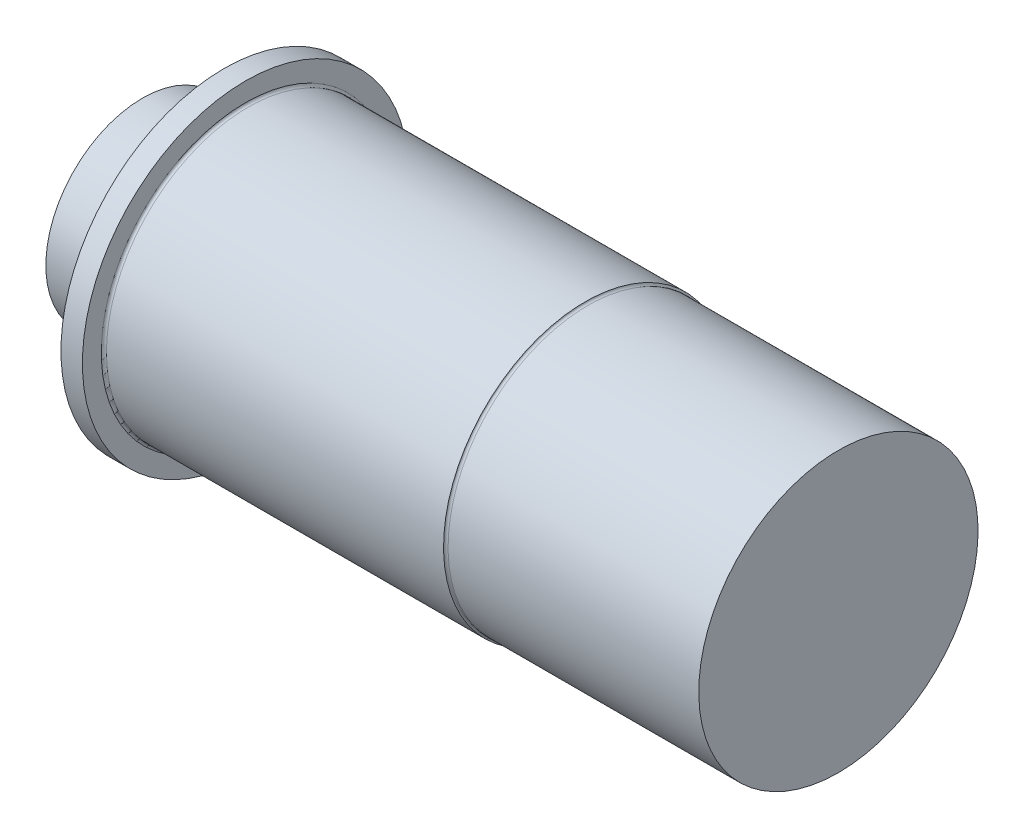
ISO-10303-21;
HEADER;
FILE_DESCRIPTION(('STEP AP214'),'2;1');
FILE_NAME('part.step','',(''),(''),'','','');
FILE_SCHEMA(('AUTOMOTIVE_DESIGN { 1 0 10303 214 1 1 1 1 }'));
ENDSEC;
DATA;
#1=APPLICATION_CONTEXT('core data for automotive mechanical design processes');
#2=APPLICATION_PROTOCOL_DEFINITION('international standard','automotive_design',2000,#1);
#3=PRODUCT_CONTEXT('',#1,'mechanical');
#4=PRODUCT('Part','Part','',(#3));
#5=PRODUCT_RELATED_PRODUCT_CATEGORY('part','',(#4));
#6=PRODUCT_DEFINITION_FORMATION('','',#4);
#7=PRODUCT_DEFINITION_CONTEXT('part definition',#1,'design');
#8=PRODUCT_DEFINITION('design','',#6,#7);
#9=PRODUCT_DEFINITION_SHAPE('','',#8);
#10=(LENGTH_UNIT() NAMED_UNIT(*) SI_UNIT(.MILLI.,.METRE.));
#11=(NAMED_UNIT(*) PLANE_ANGLE_UNIT() SI_UNIT($,.RADIAN.));
#12=(NAMED_UNIT(*) SI_UNIT($,.STERADIAN.) SOLID_ANGLE_UNIT());
#13=UNCERTAINTY_MEASURE_WITH_UNIT(LENGTH_MEASURE(1.E-05),#10,'distance_accuracy_value','');
#14=(GEOMETRIC_REPRESENTATION_CONTEXT(3) GLOBAL_UNCERTAINTY_ASSIGNED_CONTEXT((#13)) GLOBAL_UNIT_ASSIGNED_CONTEXT((#10,
#11,#12)) REPRESENTATION_CONTEXT('',''));
#15=CARTESIAN_POINT('',(0.,0.,0.));
#16=DIRECTION('',(0.,0.,1.));
#17=DIRECTION('',(1.,0.,0.));
#18=AXIS2_PLACEMENT_3D('',#15,#16,#17);
#19=CARTESIAN_POINT('',(-81.066688045695,0.,0.));
#20=DIRECTION('',(1.,0.,0.));
#21=DIRECTION('',(0.,1.,0.));
#22=AXIS2_PLACEMENT_3D('',#19,#20,#21);
#23=PLANE('',#22);
#24=CARTESIAN_POINT('',(-81.066688045695,0.,0.));
#25=DIRECTION('',(-1.,0.,0.));
#26=DIRECTION('',(0.,-1.,0.));
#27=AXIS2_PLACEMENT_3D('',#24,#25,#26);
#28=CIRCLE('',#27,22.5225);
#29=CARTESIAN_POINT('',(-81.066688045695,-22.5225,0.));
#30=VERTEX_POINT('',#29);
#31=EDGE_CURVE('E60',#30,#30,#28,.T.);
#32=ORIENTED_EDGE('',*,*,#31,.T.);
#33=EDGE_LOOP('',(#32));
#34=FACE_BOUND('',#33,.T.);
#35=ADVANCED_FACE('F37',(#34),#23,.F.);
#36=CARTESIAN_POINT('',(-122.765721941841,0.,0.));
#37=DIRECTION('',(-1.,0.,0.));
#38=DIRECTION('',(0.,-1.,0.));
#39=AXIS2_PLACEMENT_3D('',#36,#37,#38);
#40=CYLINDRICAL_SURFACE('',#39,22.5225);
#41=CARTESIAN_POINT('',(-62.666688045695,0.,0.));
#42=DIRECTION('',(1.,0.,0.));
#43=DIRECTION('',(0.,1.,0.));
#44=AXIS2_PLACEMENT_3D('',#41,#42,#43);
#45=CIRCLE('',#44,22.5225);
#46=CARTESIAN_POINT('',(-62.666688045695,22.5225,0.));
#47=VERTEX_POINT('',#46);
#48=EDGE_CURVE('E44',#47,#47,#45,.F.);
#49=ORIENTED_EDGE('',*,*,#48,.T.);
#50=EDGE_LOOP('',(#49));
#51=FACE_BOUND('',#50,.T.);
#52=ORIENTED_EDGE('',*,*,#31,.F.);
#53=EDGE_LOOP('',(#52));
#54=FACE_BOUND('',#53,.T.);
#55=ADVANCED_FACE('F95',(#51,#54),#40,.T.);
#56=CARTESIAN_POINT('',(-62.066688045695,22.5225,0.));
#57=DIRECTION('',(1.,0.,0.));
#58=DIRECTION('',(0.,1.,0.));
#59=AXIS2_PLACEMENT_3D('',#56,#57,#58);
#60=PLANE('',#59);
#61=CARTESIAN_POINT('',(-62.066688045695,0.,0.));
#62=DIRECTION('',(1.,0.,0.));
#63=DIRECTION('',(0.,1.,0.));
#64=AXIS2_PLACEMENT_3D('',#61,#62,#63);
#65=CIRCLE('',#64,23.1225);
#66=CARTESIAN_POINT('',(-62.066688045695,23.1225,0.));
#67=VERTEX_POINT('',#66);
#68=EDGE_CURVE('E10',#67,#67,#65,.T.);
#69=ORIENTED_EDGE('',*,*,#68,.T.);
#70=EDGE_LOOP('',(#69));
#71=FACE_BOUND('',#70,.T.);
#72=CARTESIAN_POINT('',(-62.066688045695,0.,0.));
#73=DIRECTION('',(-1.,0.,0.));
#74=DIRECTION('',(0.,-1.,0.));
#75=AXIS2_PLACEMENT_3D('',#72,#73,#74);
#76=CIRCLE('',#75,38.);
#77=CARTESIAN_POINT('',(-62.066688045695,-38.,0.));
#78=VERTEX_POINT('',#77);
#79=EDGE_CURVE('E63',#78,#78,#76,.T.);
#80=ORIENTED_EDGE('',*,*,#79,.T.);
#81=EDGE_LOOP('',(#80));
#82=FACE_BOUND('',#81,.T.);
#83=ADVANCED_FACE('F100',(#71,#82),#60,.F.);
#84=CARTESIAN_POINT('',(-122.765721941841,0.,0.));
#85=DIRECTION('',(-1.,0.,0.));
#86=DIRECTION('',(0.,-1.,0.));
#87=AXIS2_PLACEMENT_3D('',#84,#85,#86);
#88=CYLINDRICAL_SURFACE('',#87,38.);
#89=ORIENTED_EDGE('',*,*,#79,.F.);
#90=EDGE_LOOP('',(#89));
#91=FACE_BOUND('',#90,.T.);
#92=CARTESIAN_POINT('',(-57.066688045695,0.,0.));
#93=DIRECTION('',(-1.,0.,0.));
#94=DIRECTION('',(0.,-1.,0.));
#95=AXIS2_PLACEMENT_3D('',#92,#93,#94);
#96=CIRCLE('',#95,38.);
#97=CARTESIAN_POINT('',(-57.0666880456949,-38.,0.));
#98=VERTEX_POINT('',#97);
#99=EDGE_CURVE('E66',#98,#98,#96,.T.);
#100=ORIENTED_EDGE('',*,*,#99,.T.);
#101=EDGE_LOOP('',(#100));
#102=FACE_BOUND('',#101,.T.);
#103=ADVANCED_FACE('F116',(#91,#102),#88,.T.);
#104=CARTESIAN_POINT('',(-57.066688045695,33.,0.));
#105=DIRECTION('',(-1.,0.,0.));
#106=DIRECTION('',(0.,-1.,0.));
#107=AXIS2_PLACEMENT_3D('',#104,#105,#106);
#108=PLANE('',#107);
#109=CARTESIAN_POINT('',(-57.066688045695,0.,0.));
#110=DIRECTION('',(-1.,0.,0.));
#111=DIRECTION('',(0.,-1.,0.));
#112=AXIS2_PLACEMENT_3D('',#109,#110,#111);
#113=CIRCLE('',#112,33.6);
#114=CARTESIAN_POINT('',(-57.066688045695,-33.6,0.));
#115=VERTEX_POINT('',#114);
#116=EDGE_CURVE('E52',#115,#115,#113,.T.);
#117=ORIENTED_EDGE('',*,*,#116,.T.);
#118=EDGE_LOOP('',(#117));
#119=FACE_BOUND('',#118,.T.);
#120=ORIENTED_EDGE('',*,*,#99,.F.);
#121=EDGE_LOOP('',(#120));
#122=FACE_BOUND('',#121,.T.);
#123=ADVANCED_FACE('F113',(#119,#122),#108,.F.);
#124=CARTESIAN_POINT('',(-122.765721941841,0.,0.));
#125=DIRECTION('',(-1.,0.,0.));
#126=DIRECTION('',(0.,-1.,0.));
#127=AXIS2_PLACEMENT_3D('',#124,#125,#126);
#128=CYLINDRICAL_SURFACE('',#127,33.);
#129=CARTESIAN_POINT('',(-56.466688045695,0.,0.));
#130=DIRECTION('',(-1.,0.,0.));
#131=DIRECTION('',(0.,-1.,0.));
#132=AXIS2_PLACEMENT_3D('',#129,#130,#131);
#133=CIRCLE('',#132,33.);
#134=CARTESIAN_POINT('',(-56.466688045695,-32.9999999999999,0.));
#135=VERTEX_POINT('',#134);
#136=EDGE_CURVE('E48',#135,#135,#133,.F.);
#137=ORIENTED_EDGE('',*,*,#136,.T.);
#138=EDGE_LOOP('',(#137));
#139=FACE_BOUND('',#138,.T.);
#140=CARTESIAN_POINT('',(22.066688045695,0.,0.));
#141=DIRECTION('',(-1.,0.,0.));
#142=DIRECTION('',(0.,-1.,0.));
#143=AXIS2_PLACEMENT_3D('',#140,#141,#142);
#144=CIRCLE('',#143,33.);
#145=CARTESIAN_POINT('',(22.066688045695,-32.9999999999999,0.));
#146=VERTEX_POINT('',#145);
#147=EDGE_CURVE('E69',#146,#146,#144,.T.);
#148=ORIENTED_EDGE('',*,*,#147,.T.);
#149=EDGE_LOOP('',(#148));
#150=FACE_BOUND('',#149,.T.);
#151=ADVANCED_FACE('F91',(#139,#150),#128,.T.);
#152=CARTESIAN_POINT('',(-122.765721941841,0.,0.));
#153=DIRECTION('',(-1.,0.,0.));
#154=DIRECTION('',(0.,-1.,0.));
#155=AXIS2_PLACEMENT_3D('',#152,#153,#154);
#156=CYLINDRICAL_SURFACE('',#155,32.5325);
#157=CARTESIAN_POINT('',(22.6518749816394,0.,0.));
#158=DIRECTION('',(-1.,0.,0.));
#159=DIRECTION('',(0.,-1.,0.));
#160=AXIS2_PLACEMENT_3D('',#157,#158,#159);
#161=CIRCLE('',#160,32.5325);
#162=CARTESIAN_POINT('',(22.6518749816394,-32.5324999999999,0.));
#163=VERTEX_POINT('',#162);
#164=EDGE_CURVE('E57',#163,#163,#161,.F.);
#165=ORIENTED_EDGE('',*,*,#164,.T.);
#166=EDGE_LOOP('',(#165));
#167=FACE_BOUND('',#166,.T.);
#168=CARTESIAN_POINT('',(81.066688045695,0.,0.));
#169=DIRECTION('',(-1.,0.,0.));
#170=DIRECTION('',(0.,-1.,0.));
#171=AXIS2_PLACEMENT_3D('',#168,#169,#170);
#172=CIRCLE('',#171,32.5324999999999);
#173=CARTESIAN_POINT('',(81.066688045695,-32.5324999999999,0.));
#174=VERTEX_POINT('',#173);
#175=EDGE_CURVE('E72',#174,#174,#172,.T.);
#176=ORIENTED_EDGE('',*,*,#175,.T.);
#177=EDGE_LOOP('',(#176));
#178=FACE_BOUND('',#177,.T.);
#179=ADVANCED_FACE('F76',(#167,#178),#156,.T.);
#180=CARTESIAN_POINT('',(81.066688045695,32.5325,0.));
#181=DIRECTION('',(-1.,0.,0.));
#182=DIRECTION('',(0.,-1.,0.));
#183=AXIS2_PLACEMENT_3D('',#180,#181,#182);
#184=PLANE('',#183);
#185=ORIENTED_EDGE('',*,*,#175,.F.);
#186=EDGE_LOOP('',(#185));
#187=FACE_BOUND('',#186,.T.);
#188=ADVANCED_FACE('F78',(#187),#184,.F.);
#189=CARTESIAN_POINT('',(22.6518749816394,0.,0.));
#190=DIRECTION('',(-1.,0.,0.));
#191=DIRECTION('',(0.,-1.,0.));
#192=AXIS2_PLACEMENT_3D('',#189,#190,#191);
#193=TOROIDAL_SURFACE('',#192,33.1325,0.6);
#194=ORIENTED_EDGE('',*,*,#164,.F.);
#195=EDGE_LOOP('',(#194));
#196=FACE_BOUND('',#195,.T.);
#197=ORIENTED_EDGE('',*,*,#147,.F.);
#198=EDGE_LOOP('',(#197));
#199=FACE_BOUND('',#198,.T.);
#200=ADVANCED_FACE('F80',(#196,#199),#193,.F.);
#201=CARTESIAN_POINT('',(-56.466688045695,0.,0.));
#202=DIRECTION('',(-1.,0.,0.));
#203=DIRECTION('',(0.,-1.,0.));
#204=AXIS2_PLACEMENT_3D('',#201,#202,#203);
#205=TOROIDAL_SURFACE('',#204,33.6,0.6);
#206=ORIENTED_EDGE('',*,*,#136,.F.);
#207=EDGE_LOOP('',(#206));
#208=FACE_BOUND('',#207,.T.);
#209=ORIENTED_EDGE('',*,*,#116,.F.);
#210=EDGE_LOOP('',(#209));
#211=FACE_BOUND('',#210,.T.);
#212=ADVANCED_FACE('F87',(#208,#211),#205,.F.);
#213=CARTESIAN_POINT('',(-62.666688045695,0.,0.));
#214=DIRECTION('',(1.,0.,0.));
#215=DIRECTION('',(0.,1.,0.));
#216=AXIS2_PLACEMENT_3D('',#213,#214,#215);
#217=TOROIDAL_SURFACE('',#216,23.1225,0.6);
#218=ORIENTED_EDGE('',*,*,#68,.F.);
#219=EDGE_LOOP('',(#218));
#220=FACE_BOUND('',#219,.T.);
#221=ORIENTED_EDGE('',*,*,#48,.F.);
#222=EDGE_LOOP('',(#221));
#223=FACE_BOUND('',#222,.T.);
#224=ADVANCED_FACE('F39',(#220,#223),#217,.F.);
#225=CLOSED_SHELL('',(#35,#55,#83,#103,#123,#151,#179,#188,#200,#212,#224));
#226=MANIFOLD_SOLID_BREP('B2',#225);
#227=ADVANCED_BREP_SHAPE_REPRESENTATION('',(#18,#226),#14);
#228=SHAPE_DEFINITION_REPRESENTATION(#9,#227);
ENDSEC;
END-ISO-10303-21;
